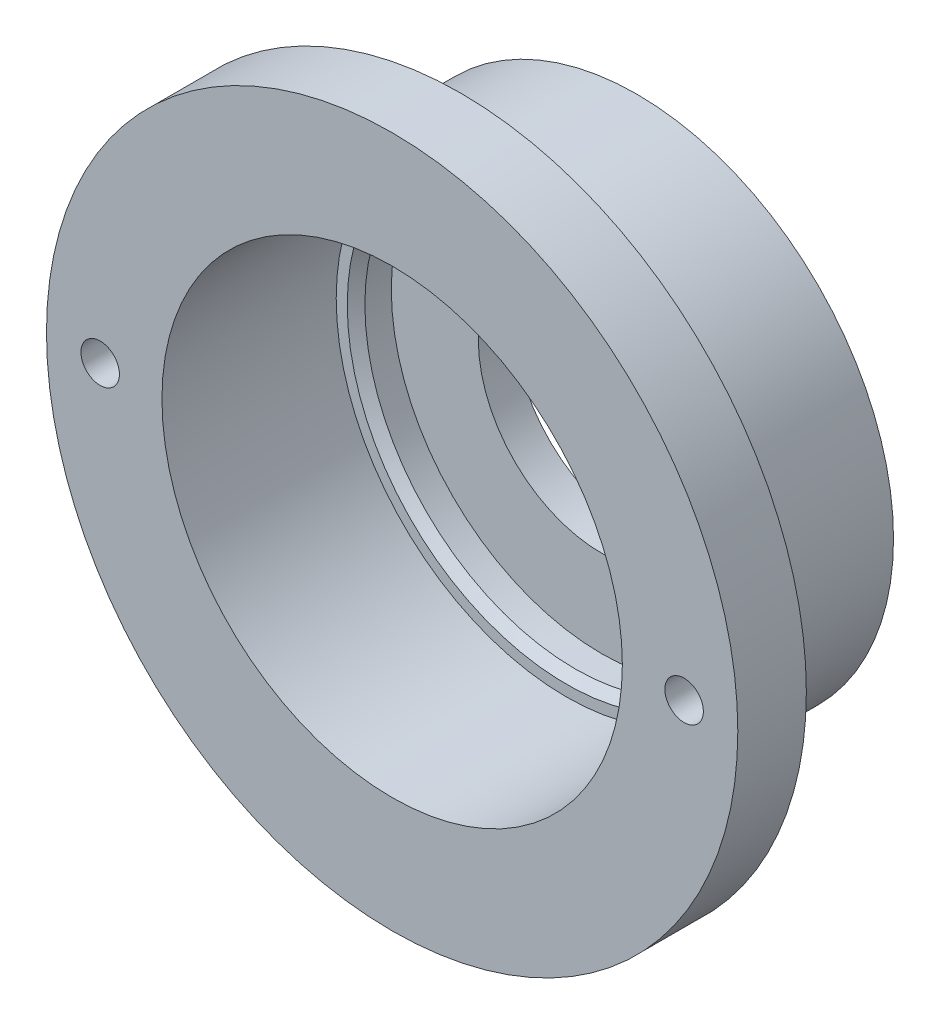
ISO-10303-21;
HEADER;
FILE_DESCRIPTION(('STEP AP214'),'2;1');
FILE_NAME('part.step','',(''),(''),'','','');
FILE_SCHEMA(('AUTOMOTIVE_DESIGN { 1 0 10303 214 1 1 1 1 }'));
ENDSEC;
DATA;
#1=APPLICATION_CONTEXT('core data for automotive mechanical design processes');
#2=APPLICATION_PROTOCOL_DEFINITION('international standard','automotive_design',2000,#1);
#3=PRODUCT_CONTEXT('',#1,'mechanical');
#4=PRODUCT('Part','Part','',(#3));
#5=PRODUCT_RELATED_PRODUCT_CATEGORY('part','',(#4));
#6=PRODUCT_DEFINITION_FORMATION('','',#4);
#7=PRODUCT_DEFINITION_CONTEXT('part definition',#1,'design');
#8=PRODUCT_DEFINITION('design','',#6,#7);
#9=PRODUCT_DEFINITION_SHAPE('','',#8);
#10=(LENGTH_UNIT() NAMED_UNIT(*) SI_UNIT(.MILLI.,.METRE.));
#11=(NAMED_UNIT(*) PLANE_ANGLE_UNIT() SI_UNIT($,.RADIAN.));
#12=(NAMED_UNIT(*) SI_UNIT($,.STERADIAN.) SOLID_ANGLE_UNIT());
#13=UNCERTAINTY_MEASURE_WITH_UNIT(LENGTH_MEASURE(1.E-05),#10,'distance_accuracy_value','');
#14=(GEOMETRIC_REPRESENTATION_CONTEXT(3) GLOBAL_UNCERTAINTY_ASSIGNED_CONTEXT((#13)) GLOBAL_UNIT_ASSIGNED_CONTEXT((#10,
#11,#12)) REPRESENTATION_CONTEXT('',''));
#15=CARTESIAN_POINT('',(0.,0.,0.));
#16=DIRECTION('',(0.,0.,1.));
#17=DIRECTION('',(1.,0.,0.));
#18=AXIS2_PLACEMENT_3D('',#15,#16,#17);
#19=CARTESIAN_POINT('',(0.,0.,-4.70047346479343));
#20=DIRECTION('',(0.,0.,-1.));
#21=DIRECTION('',(-1.,0.,0.));
#22=AXIS2_PLACEMENT_3D('',#19,#20,#21);
#23=PLANE('',#22);
#24=CARTESIAN_POINT('',(0.,0.,-4.70047346479343));
#25=DIRECTION('',(0.,0.,-1.));
#26=DIRECTION('',(-1.,0.,0.));
#27=AXIS2_PLACEMENT_3D('',#24,#25,#26);
#28=CIRCLE('',#27,7.);
#29=CARTESIAN_POINT('',(-7.,0.,-4.70047346479343));
#30=VERTEX_POINT('',#29);
#31=EDGE_CURVE('E55',#30,#30,#28,.T.);
#32=ORIENTED_EDGE('',*,*,#31,.F.);
#33=EDGE_LOOP('',(#32));
#34=FACE_BOUND('',#33,.T.);
#35=CARTESIAN_POINT('',(0.,0.,-4.70047346479343));
#36=DIRECTION('',(0.,0.,-1.));
#37=DIRECTION('',(-1.,0.,0.));
#38=AXIS2_PLACEMENT_3D('',#35,#36,#37);
#39=CIRCLE('',#38,14.565);
#40=CARTESIAN_POINT('',(-14.565,0.,-4.70047346479343));
#41=VERTEX_POINT('',#40);
#42=EDGE_CURVE('E71',#41,#41,#39,.T.);
#43=ORIENTED_EDGE('',*,*,#42,.T.);
#44=EDGE_LOOP('',(#43));
#45=FACE_BOUND('',#44,.T.);
#46=ADVANCED_FACE('F35',(#34,#45),#23,.T.);
#47=CARTESIAN_POINT('',(0.,0.,-25.4112856059014));
#48=DIRECTION('',(0.,0.,-1.));
#49=DIRECTION('',(-1.,0.,0.));
#50=AXIS2_PLACEMENT_3D('',#47,#48,#49);
#51=CYLINDRICAL_SURFACE('',#50,19.6178195017485);
#52=CARTESIAN_POINT('',(0.,0.,9.18952653520658));
#53=DIRECTION('',(0.,0.,-1.));
#54=DIRECTION('',(-1.,0.,0.));
#55=AXIS2_PLACEMENT_3D('',#52,#53,#54);
#56=CIRCLE('',#55,19.6178195017485);
#57=CARTESIAN_POINT('',(-19.6178195017485,0.,9.18952653520658));
#58=VERTEX_POINT('',#57);
#59=EDGE_CURVE('E46',#58,#58,#56,.T.);
#60=ORIENTED_EDGE('',*,*,#59,.T.);
#61=EDGE_LOOP('',(#60));
#62=FACE_BOUND('',#61,.T.);
#63=CARTESIAN_POINT('',(0.,0.,5.29952653520657));
#64=DIRECTION('',(0.,0.,-1.));
#65=DIRECTION('',(-1.,0.,0.));
#66=AXIS2_PLACEMENT_3D('',#63,#64,#65);
#67=CIRCLE('',#66,19.6178195017485);
#68=CARTESIAN_POINT('',(-19.6178195017485,0.,5.29952653520657));
#69=VERTEX_POINT('',#68);
#70=EDGE_CURVE('E53',#69,#69,#67,.F.);
#71=ORIENTED_EDGE('',*,*,#70,.T.);
#72=EDGE_LOOP('',(#71));
#73=FACE_BOUND('',#72,.T.);
#74=ADVANCED_FACE('F117',(#62,#73),#51,.T.);
#75=CARTESIAN_POINT('',(0.,0.,9.18952653520657));
#76=DIRECTION('',(0.,0.,-1.));
#77=DIRECTION('',(-1.,0.,0.));
#78=AXIS2_PLACEMENT_3D('',#75,#76,#77);
#79=PLANE('',#78);
#80=CARTESIAN_POINT('',(16.57,0.,9.18952653520658));
#81=DIRECTION('',(0.,0.,-1.));
#82=DIRECTION('',(1.,0.,0.));
#83=AXIS2_PLACEMENT_3D('',#80,#81,#82);
#84=CIRCLE('',#83,1.0922);
#85=CARTESIAN_POINT('',(17.6622,0.,9.18952653520658));
#86=VERTEX_POINT('',#85);
#87=EDGE_CURVE('E80',#86,#86,#84,.T.);
#88=ORIENTED_EDGE('',*,*,#87,.T.);
#89=EDGE_LOOP('',(#88));
#90=FACE_BOUND('',#89,.T.);
#91=CARTESIAN_POINT('',(-16.57,0.,9.18952653520658));
#92=DIRECTION('',(0.,0.,-1.));
#93=DIRECTION('',(-1.,0.,0.));
#94=AXIS2_PLACEMENT_3D('',#91,#92,#93);
#95=CIRCLE('',#94,1.0922);
#96=CARTESIAN_POINT('',(-17.6622,0.,9.18952653520658));
#97=VERTEX_POINT('',#96);
#98=EDGE_CURVE('E74',#97,#97,#95,.T.);
#99=ORIENTED_EDGE('',*,*,#98,.T.);
#100=EDGE_LOOP('',(#99));
#101=FACE_BOUND('',#100,.T.);
#102=ORIENTED_EDGE('',*,*,#59,.F.);
#103=EDGE_LOOP('',(#102));
#104=FACE_BOUND('',#103,.T.);
#105=CARTESIAN_POINT('',(0.,0.,9.18952653520658));
#106=DIRECTION('',(0.,0.,-1.));
#107=DIRECTION('',(-1.,0.,0.));
#108=AXIS2_PLACEMENT_3D('',#105,#106,#107);
#109=CIRCLE('',#108,13.0646195017485);
#110=CARTESIAN_POINT('',(-13.0646195017485,0.,9.18952653520658));
#111=VERTEX_POINT('',#110);
#112=EDGE_CURVE('E50',#111,#111,#109,.T.);
#113=ORIENTED_EDGE('',*,*,#112,.T.);
#114=EDGE_LOOP('',(#113));
#115=FACE_BOUND('',#114,.T.);
#116=ADVANCED_FACE('F89',(#90,#101,#104,#115),#79,.F.);
#117=CARTESIAN_POINT('',(0.,0.,-25.4112856059014));
#118=DIRECTION('',(0.,0.,-1.));
#119=DIRECTION('',(-1.,0.,0.));
#120=AXIS2_PLACEMENT_3D('',#117,#118,#119);
#121=CYLINDRICAL_SURFACE('',#120,13.0646195017485);
#122=ORIENTED_EDGE('',*,*,#112,.F.);
#123=EDGE_LOOP('',(#122));
#124=FACE_BOUND('',#123,.T.);
#125=CARTESIAN_POINT('',(0.,0.,-0.70047346479343));
#126=DIRECTION('',(0.,0.,-1.));
#127=DIRECTION('',(-1.,0.,0.));
#128=AXIS2_PLACEMENT_3D('',#125,#126,#127);
#129=CIRCLE('',#128,13.0646195017485);
#130=CARTESIAN_POINT('',(-13.0646195017485,0.,-0.70047346479343));
#131=VERTEX_POINT('',#130);
#132=EDGE_CURVE('E60',#131,#131,#129,.T.);
#133=ORIENTED_EDGE('',*,*,#132,.T.);
#134=EDGE_LOOP('',(#133));
#135=FACE_BOUND('',#134,.T.);
#136=ADVANCED_FACE('F128',(#124,#135),#121,.F.);
#137=CARTESIAN_POINT('',(0.,0.,-0.700473464793428));
#138=DIRECTION('',(0.,0.,-1.));
#139=DIRECTION('',(-1.,0.,0.));
#140=AXIS2_PLACEMENT_3D('',#137,#138,#139);
#141=PLANE('',#140);
#142=CARTESIAN_POINT('',(0.,0.,-0.700473464793428));
#143=DIRECTION('',(0.,0.,-1.));
#144=DIRECTION('',(-1.,0.,0.));
#145=AXIS2_PLACEMENT_3D('',#142,#143,#144);
#146=CIRCLE('',#145,12.438);
#147=CARTESIAN_POINT('',(-12.438,0.,-0.700473464793428));
#148=VERTEX_POINT('',#147);
#149=EDGE_CURVE('E42',#148,#148,#146,.T.);
#150=ORIENTED_EDGE('',*,*,#149,.T.);
#151=EDGE_LOOP('',(#150));
#152=FACE_BOUND('',#151,.T.);
#153=ORIENTED_EDGE('',*,*,#132,.F.);
#154=EDGE_LOOP('',(#153));
#155=FACE_BOUND('',#154,.T.);
#156=ADVANCED_FACE('F131',(#152,#155),#141,.F.);
#157=CARTESIAN_POINT('',(0.,0.,-25.4112856059014));
#158=DIRECTION('',(0.,0.,-1.));
#159=DIRECTION('',(-1.,0.,0.));
#160=AXIS2_PLACEMENT_3D('',#157,#158,#159);
#161=CYLINDRICAL_SURFACE('',#160,11.938);
#162=CARTESIAN_POINT('',(0.,0.,-1.20047346479342));
#163=DIRECTION('',(0.,0.,-1.));
#164=DIRECTION('',(-1.,0.,0.));
#165=AXIS2_PLACEMENT_3D('',#162,#163,#164);
#166=CIRCLE('',#165,11.938);
#167=CARTESIAN_POINT('',(-11.938,0.,-1.20047346479342));
#168=VERTEX_POINT('',#167);
#169=EDGE_CURVE('E10',#168,#168,#166,.F.);
#170=ORIENTED_EDGE('',*,*,#169,.T.);
#171=EDGE_LOOP('',(#170));
#172=FACE_BOUND('',#171,.T.);
#173=CARTESIAN_POINT('',(0.,0.,-2.70047346479343));
#174=DIRECTION('',(0.,0.,-1.));
#175=DIRECTION('',(-1.,0.,0.));
#176=AXIS2_PLACEMENT_3D('',#173,#174,#175);
#177=CIRCLE('',#176,11.938);
#178=CARTESIAN_POINT('',(-11.938,0.,-2.70047346479343));
#179=VERTEX_POINT('',#178);
#180=EDGE_CURVE('E63',#179,#179,#177,.T.);
#181=ORIENTED_EDGE('',*,*,#180,.T.);
#182=EDGE_LOOP('',(#181));
#183=FACE_BOUND('',#182,.T.);
#184=ADVANCED_FACE('F135',(#172,#183),#161,.F.);
#185=CARTESIAN_POINT('',(0.,0.,-2.70047346479343));
#186=DIRECTION('',(0.,0.,-1.));
#187=DIRECTION('',(-1.,0.,0.));
#188=AXIS2_PLACEMENT_3D('',#185,#186,#187);
#189=PLANE('',#188);
#190=ORIENTED_EDGE('',*,*,#180,.F.);
#191=EDGE_LOOP('',(#190));
#192=FACE_BOUND('',#191,.T.);
#193=CARTESIAN_POINT('',(0.,0.,-2.70047346479343));
#194=DIRECTION('',(0.,0.,-1.));
#195=DIRECTION('',(-1.,0.,0.));
#196=AXIS2_PLACEMENT_3D('',#193,#194,#195);
#197=CIRCLE('',#196,7.);
#198=CARTESIAN_POINT('',(-7.,0.,-2.70047346479343));
#199=VERTEX_POINT('',#198);
#200=EDGE_CURVE('E66',#199,#199,#197,.T.);
#201=ORIENTED_EDGE('',*,*,#200,.T.);
#202=EDGE_LOOP('',(#201));
#203=FACE_BOUND('',#202,.T.);
#204=ADVANCED_FACE('F138',(#192,#203),#189,.F.);
#205=CARTESIAN_POINT('',(0.,0.,-25.4112856059014));
#206=DIRECTION('',(0.,0.,-1.));
#207=DIRECTION('',(-1.,0.,0.));
#208=AXIS2_PLACEMENT_3D('',#205,#206,#207);
#209=CYLINDRICAL_SURFACE('',#208,7.);
#210=ORIENTED_EDGE('',*,*,#200,.F.);
#211=EDGE_LOOP('',(#210));
#212=FACE_BOUND('',#211,.T.);
#213=ORIENTED_EDGE('',*,*,#31,.T.);
#214=EDGE_LOOP('',(#213));
#215=FACE_BOUND('',#214,.T.);
#216=ADVANCED_FACE('F103',(#212,#215),#209,.F.);
#217=CARTESIAN_POINT('',(0.,0.,5.29952653520657));
#218=DIRECTION('',(0.,0.,-1.));
#219=DIRECTION('',(-1.,0.,0.));
#220=AXIS2_PLACEMENT_3D('',#217,#218,#219);
#221=PLANE('',#220);
#222=CARTESIAN_POINT('',(16.57,0.,5.29952653520657));
#223=DIRECTION('',(0.,0.,-1.));
#224=DIRECTION('',(1.,0.,0.));
#225=AXIS2_PLACEMENT_3D('',#222,#223,#224);
#226=CIRCLE('',#225,1.0922);
#227=CARTESIAN_POINT('',(17.6622,0.,5.29952653520657));
#228=VERTEX_POINT('',#227);
#229=EDGE_CURVE('E83',#228,#228,#226,.T.);
#230=ORIENTED_EDGE('',*,*,#229,.F.);
#231=EDGE_LOOP('',(#230));
#232=FACE_BOUND('',#231,.T.);
#233=CARTESIAN_POINT('',(-16.57,0.,5.29952653520657));
#234=DIRECTION('',(0.,0.,-1.));
#235=DIRECTION('',(-1.,0.,0.));
#236=AXIS2_PLACEMENT_3D('',#233,#234,#235);
#237=CIRCLE('',#236,1.0922);
#238=CARTESIAN_POINT('',(-17.6622,0.,5.29952653520657));
#239=VERTEX_POINT('',#238);
#240=EDGE_CURVE('E77',#239,#239,#237,.T.);
#241=ORIENTED_EDGE('',*,*,#240,.F.);
#242=EDGE_LOOP('',(#241));
#243=FACE_BOUND('',#242,.T.);
#244=ORIENTED_EDGE('',*,*,#70,.F.);
#245=EDGE_LOOP('',(#244));
#246=FACE_BOUND('',#245,.T.);
#247=CARTESIAN_POINT('',(0.,0.,5.29952653520657));
#248=DIRECTION('',(0.,0.,-1.));
#249=DIRECTION('',(-1.,0.,0.));
#250=AXIS2_PLACEMENT_3D('',#247,#248,#249);
#251=CIRCLE('',#250,14.565);
#252=CARTESIAN_POINT('',(-14.565,0.,5.29952653520657));
#253=VERTEX_POINT('',#252);
#254=EDGE_CURVE('E56',#253,#253,#251,.T.);
#255=ORIENTED_EDGE('',*,*,#254,.F.);
#256=EDGE_LOOP('',(#255));
#257=FACE_BOUND('',#256,.T.);
#258=ADVANCED_FACE('F99',(#232,#243,#246,#257),#221,.T.);
#259=CARTESIAN_POINT('',(0.,0.,5.29952653520657));
#260=DIRECTION('',(0.,0.,-1.));
#261=DIRECTION('',(-1.,0.,0.));
#262=AXIS2_PLACEMENT_3D('',#259,#260,#261);
#263=CYLINDRICAL_SURFACE('',#262,14.565);
#264=ORIENTED_EDGE('',*,*,#254,.T.);
#265=EDGE_LOOP('',(#264));
#266=FACE_BOUND('',#265,.T.);
#267=ORIENTED_EDGE('',*,*,#42,.F.);
#268=EDGE_LOOP('',(#267));
#269=FACE_BOUND('',#268,.T.);
#270=ADVANCED_FACE('F102',(#266,#269),#263,.T.);
#271=CARTESIAN_POINT('',(-16.57,0.,9.18952653520658));
#272=DIRECTION('',(0.,0.,-1.));
#273=DIRECTION('',(-1.,0.,0.));
#274=AXIS2_PLACEMENT_3D('',#271,#272,#273);
#275=CYLINDRICAL_SURFACE('',#274,1.0922);
#276=ORIENTED_EDGE('',*,*,#98,.F.);
#277=EDGE_LOOP('',(#276));
#278=FACE_BOUND('',#277,.T.);
#279=ORIENTED_EDGE('',*,*,#240,.T.);
#280=EDGE_LOOP('',(#279));
#281=FACE_BOUND('',#280,.T.);
#282=ADVANCED_FACE('F95',(#278,#281),#275,.F.);
#283=CARTESIAN_POINT('',(16.57,0.,9.18952653520658));
#284=DIRECTION('',(0.,0.,-1.));
#285=DIRECTION('',(-1.,0.,0.));
#286=AXIS2_PLACEMENT_3D('',#283,#284,#285);
#287=CYLINDRICAL_SURFACE('',#286,1.0922);
#288=ORIENTED_EDGE('',*,*,#87,.F.);
#289=EDGE_LOOP('',(#288));
#290=FACE_BOUND('',#289,.T.);
#291=ORIENTED_EDGE('',*,*,#229,.T.);
#292=EDGE_LOOP('',(#291));
#293=FACE_BOUND('',#292,.T.);
#294=ADVANCED_FACE('F92',(#290,#293),#287,.F.);
#295=CARTESIAN_POINT('',(0.,0.,-0.70047346479343));
#296=DIRECTION('',(0.,0.,1.));
#297=DIRECTION('',(1.,0.,0.));
#298=AXIS2_PLACEMENT_3D('',#295,#296,#297);
#299=CONICAL_SURFACE('',#298,12.438,0.78539816339745);
#300=ORIENTED_EDGE('',*,*,#169,.F.);
#301=EDGE_LOOP('',(#300));
#302=FACE_BOUND('',#301,.T.);
#303=ORIENTED_EDGE('',*,*,#149,.F.);
#304=EDGE_LOOP('',(#303));
#305=FACE_BOUND('',#304,.T.);
#306=ADVANCED_FACE('F37',(#302,#305),#299,.F.);
#307=CLOSED_SHELL('',(#46,#74,#116,#136,#156,#184,#204,#216,#258,#270,#282,#294,#306));
#308=MANIFOLD_SOLID_BREP('B2',#307);
#309=ADVANCED_BREP_SHAPE_REPRESENTATION('',(#18,#308),#14);
#310=SHAPE_DEFINITION_REPRESENTATION(#9,#309);
ENDSEC;
END-ISO-10303-21;
